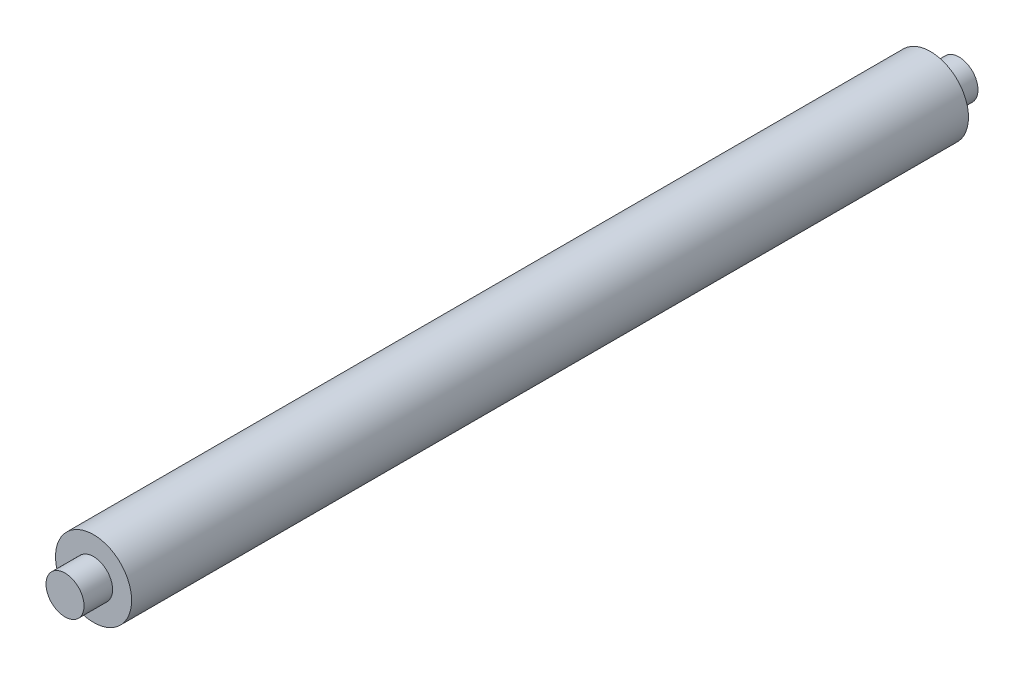
ISO-10303-21;
HEADER;
FILE_DESCRIPTION(('STEP AP214'),'2;1');
FILE_NAME('part.step','',(''),(''),'','','');
FILE_SCHEMA(('AUTOMOTIVE_DESIGN { 1 0 10303 214 1 1 1 1 }'));
ENDSEC;
DATA;
#1=APPLICATION_CONTEXT('core data for automotive mechanical design processes');
#2=APPLICATION_PROTOCOL_DEFINITION('international standard','automotive_design',2000,#1);
#3=PRODUCT_CONTEXT('',#1,'mechanical');
#4=PRODUCT('Part','Part','',(#3));
#5=PRODUCT_RELATED_PRODUCT_CATEGORY('part','',(#4));
#6=PRODUCT_DEFINITION_FORMATION('','',#4);
#7=PRODUCT_DEFINITION_CONTEXT('part definition',#1,'design');
#8=PRODUCT_DEFINITION('design','',#6,#7);
#9=PRODUCT_DEFINITION_SHAPE('','',#8);
#10=(LENGTH_UNIT() NAMED_UNIT(*) SI_UNIT(.MILLI.,.METRE.));
#11=(NAMED_UNIT(*) PLANE_ANGLE_UNIT() SI_UNIT($,.RADIAN.));
#12=(NAMED_UNIT(*) SI_UNIT($,.STERADIAN.) SOLID_ANGLE_UNIT());
#13=UNCERTAINTY_MEASURE_WITH_UNIT(LENGTH_MEASURE(1.E-05),#10,'distance_accuracy_value','');
#14=(GEOMETRIC_REPRESENTATION_CONTEXT(3) GLOBAL_UNCERTAINTY_ASSIGNED_CONTEXT((#13)) GLOBAL_UNIT_ASSIGNED_CONTEXT((#10,
#11,#12)) REPRESENTATION_CONTEXT('',''));
#15=CARTESIAN_POINT('',(0.,0.,0.));
#16=DIRECTION('',(0.,0.,1.));
#17=DIRECTION('',(1.,0.,0.));
#18=AXIS2_PLACEMENT_3D('',#15,#16,#17);
#19=CARTESIAN_POINT('',(0.,0.,279.4));
#20=DIRECTION('',(0.,0.,1.));
#21=DIRECTION('',(1.,0.,0.));
#22=AXIS2_PLACEMENT_3D('',#19,#20,#21);
#23=PLANE('',#22);
#24=CARTESIAN_POINT('',(0.,0.,279.4));
#25=DIRECTION('',(0.,0.,1.));
#26=DIRECTION('',(1.,0.,0.));
#27=AXIS2_PLACEMENT_3D('',#24,#25,#26);
#28=CIRCLE('',#27,25.4);
#29=CARTESIAN_POINT('',(25.4,0.,279.4));
#30=VERTEX_POINT('',#29);
#31=EDGE_CURVE('E10',#30,#30,#28,.T.);
#32=ORIENTED_EDGE('',*,*,#31,.T.);
#33=EDGE_LOOP('',(#32));
#34=FACE_BOUND('',#33,.T.);
#35=CARTESIAN_POINT('',(0.,0.,279.4));
#36=DIRECTION('',(0.,0.,1.));
#37=DIRECTION('',(1.,0.,0.));
#38=AXIS2_PLACEMENT_3D('',#35,#36,#37);
#39=CIRCLE('',#38,12.7);
#40=CARTESIAN_POINT('',(-12.7,0.,279.4));
#41=VERTEX_POINT('',#40);
#42=EDGE_CURVE('E45',#41,#41,#39,.T.);
#43=ORIENTED_EDGE('',*,*,#42,.F.);
#44=EDGE_LOOP('',(#43));
#45=FACE_BOUND('',#44,.T.);
#46=ADVANCED_FACE('F32',(#34,#45),#23,.T.);
#47=CARTESIAN_POINT('',(0.,0.,279.4));
#48=DIRECTION('',(0.,0.,-1.));
#49=DIRECTION('',(-1.,0.,0.));
#50=AXIS2_PLACEMENT_3D('',#47,#48,#49);
#51=CYLINDRICAL_SURFACE('',#50,25.4);
#52=ORIENTED_EDGE('',*,*,#31,.F.);
#53=EDGE_LOOP('',(#52));
#54=FACE_BOUND('',#53,.T.);
#55=CARTESIAN_POINT('',(0.,0.,-279.4));
#56=DIRECTION('',(0.,0.,1.));
#57=DIRECTION('',(1.,0.,0.));
#58=AXIS2_PLACEMENT_3D('',#55,#56,#57);
#59=CIRCLE('',#58,25.4);
#60=CARTESIAN_POINT('',(25.4,0.,-279.4));
#61=VERTEX_POINT('',#60);
#62=EDGE_CURVE('E36',#61,#61,#59,.T.);
#63=ORIENTED_EDGE('',*,*,#62,.T.);
#64=EDGE_LOOP('',(#63));
#65=FACE_BOUND('',#64,.T.);
#66=ADVANCED_FACE('F34',(#54,#65),#51,.T.);
#67=CARTESIAN_POINT('',(0.,0.,-279.4));
#68=DIRECTION('',(0.,0.,1.));
#69=DIRECTION('',(1.,0.,0.));
#70=AXIS2_PLACEMENT_3D('',#67,#68,#69);
#71=PLANE('',#70);
#72=CARTESIAN_POINT('',(0.,0.,-279.4));
#73=DIRECTION('',(0.,0.,1.));
#74=DIRECTION('',(1.,0.,0.));
#75=AXIS2_PLACEMENT_3D('',#72,#73,#74);
#76=CIRCLE('',#75,12.7);
#77=CARTESIAN_POINT('',(12.7,0.,-279.4));
#78=VERTEX_POINT('',#77);
#79=EDGE_CURVE('E51',#78,#78,#76,.T.);
#80=ORIENTED_EDGE('',*,*,#79,.T.);
#81=EDGE_LOOP('',(#80));
#82=FACE_BOUND('',#81,.T.);
#83=ORIENTED_EDGE('',*,*,#62,.F.);
#84=EDGE_LOOP('',(#83));
#85=FACE_BOUND('',#84,.T.);
#86=ADVANCED_FACE('F73',(#82,#85),#71,.F.);
#87=CARTESIAN_POINT('',(0.,0.,298.45));
#88=DIRECTION('',(0.,0.,-1.));
#89=DIRECTION('',(-1.,0.,0.));
#90=AXIS2_PLACEMENT_3D('',#87,#88,#89);
#91=CYLINDRICAL_SURFACE('',#90,12.7);
#92=CARTESIAN_POINT('',(0.,0.,298.45));
#93=DIRECTION('',(0.,0.,1.));
#94=DIRECTION('',(1.,0.,0.));
#95=AXIS2_PLACEMENT_3D('',#92,#93,#94);
#96=CIRCLE('',#95,12.7);
#97=CARTESIAN_POINT('',(-12.7,0.,298.45));
#98=VERTEX_POINT('',#97);
#99=EDGE_CURVE('E43',#98,#98,#96,.T.);
#100=CARTESIAN_POINT('',(-12.7,0.,298.45));
#101=CARTESIAN_POINT('',(-12.7,0.,298.2515625));
#102=CARTESIAN_POINT('',(-12.7,0.,298.053125));
#103=CARTESIAN_POINT('',(-12.7,0.,297.65625));
#104=CARTESIAN_POINT('',(-12.7,0.,297.4578125));
#105=CARTESIAN_POINT('',(-12.7,0.,297.0609375));
#106=CARTESIAN_POINT('',(-12.7,0.,296.8625));
#107=CARTESIAN_POINT('',(-12.7,0.,296.465625));
#108=CARTESIAN_POINT('',(-12.7,0.,296.2671875));
#109=CARTESIAN_POINT('',(-12.7,0.,295.8703125));
#110=CARTESIAN_POINT('',(-12.7,0.,295.671875));
#111=CARTESIAN_POINT('',(-12.7,0.,295.275));
#112=CARTESIAN_POINT('',(-12.7,0.,295.0765625));
#113=CARTESIAN_POINT('',(-12.7,0.,294.6796875));
#114=CARTESIAN_POINT('',(-12.7,0.,294.48125));
#115=CARTESIAN_POINT('',(-12.7,0.,294.084375));
#116=CARTESIAN_POINT('',(-12.7,0.,293.8859375));
#117=CARTESIAN_POINT('',(-12.7,0.,293.4890625));
#118=CARTESIAN_POINT('',(-12.7,0.,293.290625));
#119=CARTESIAN_POINT('',(-12.7,0.,292.89375));
#120=CARTESIAN_POINT('',(-12.7,0.,292.6953125));
#121=CARTESIAN_POINT('',(-12.7,0.,292.2984375));
#122=CARTESIAN_POINT('',(-12.7,0.,292.1));
#123=CARTESIAN_POINT('',(-12.7,0.,291.703125));
#124=CARTESIAN_POINT('',(-12.7,0.,291.5046875));
#125=CARTESIAN_POINT('',(-12.7,0.,291.1078125));
#126=CARTESIAN_POINT('',(-12.7,0.,290.909375));
#127=CARTESIAN_POINT('',(-12.7,0.,290.5125));
#128=CARTESIAN_POINT('',(-12.7,0.,290.3140625));
#129=CARTESIAN_POINT('',(-12.7,0.,289.9171875));
#130=CARTESIAN_POINT('',(-12.7,0.,289.71875));
#131=CARTESIAN_POINT('',(-12.7,0.,289.321875));
#132=CARTESIAN_POINT('',(-12.7,0.,289.1234375));
#133=CARTESIAN_POINT('',(-12.7,0.,288.7265625));
#134=CARTESIAN_POINT('',(-12.7,0.,288.528125));
#135=CARTESIAN_POINT('',(-12.7,0.,288.13125));
#136=CARTESIAN_POINT('',(-12.7,0.,287.9328125));
#137=CARTESIAN_POINT('',(-12.7,0.,287.5359375));
#138=CARTESIAN_POINT('',(-12.7,0.,287.3375));
#139=CARTESIAN_POINT('',(-12.7,0.,286.940625));
#140=CARTESIAN_POINT('',(-12.7,0.,286.7421875));
#141=CARTESIAN_POINT('',(-12.7,0.,286.3453125));
#142=CARTESIAN_POINT('',(-12.7,0.,286.146875));
#143=CARTESIAN_POINT('',(-12.7,0.,285.75));
#144=CARTESIAN_POINT('',(-12.7,0.,285.5515625));
#145=CARTESIAN_POINT('',(-12.7,0.,285.1546875));
#146=CARTESIAN_POINT('',(-12.7,0.,284.95625));
#147=CARTESIAN_POINT('',(-12.7,0.,284.559375));
#148=CARTESIAN_POINT('',(-12.7,0.,284.3609375));
#149=CARTESIAN_POINT('',(-12.7,0.,283.9640625));
#150=CARTESIAN_POINT('',(-12.7,0.,283.765625));
#151=CARTESIAN_POINT('',(-12.7,0.,283.36875));
#152=CARTESIAN_POINT('',(-12.7,0.,283.1703125));
#153=CARTESIAN_POINT('',(-12.7,0.,282.7734375));
#154=CARTESIAN_POINT('',(-12.7,0.,282.575));
#155=CARTESIAN_POINT('',(-12.7,0.,282.178125));
#156=CARTESIAN_POINT('',(-12.7,0.,281.9796875));
#157=CARTESIAN_POINT('',(-12.7,0.,281.5828125));
#158=CARTESIAN_POINT('',(-12.7,0.,281.384375));
#159=CARTESIAN_POINT('',(-12.7,0.,280.9875));
#160=CARTESIAN_POINT('',(-12.7,0.,280.7890625));
#161=CARTESIAN_POINT('',(-12.7,0.,280.3921875));
#162=CARTESIAN_POINT('',(-12.7,0.,280.19375));
#163=CARTESIAN_POINT('',(-12.7,0.,279.796875));
#164=CARTESIAN_POINT('',(-12.7,0.,279.5984375));
#165=CARTESIAN_POINT('',(-12.7,0.,279.4));
#166=B_SPLINE_CURVE_WITH_KNOTS('',3,(#100,#101,#102,#103,#104,#105,#106,#107,#108,#109,#110,
#111,#112,#113,#114,#115,#116,#117,#118,#119,#120,#121,#122,#123,#124,#125,#126,#127,#128,#129,
#130,#131,#132,#133,#134,#135,#136,#137,#138,#139,#140,#141,#142,#143,#144,#145,#146,#147,#148,
#149,#150,#151,#152,#153,#154,#155,#156,#157,#158,#159,#160,#161,#162,#163,#164,#165),
.UNSPECIFIED.,.F.,.F.,(4,2,2,2,2,2,2,2,2,2,2,2,2,2,2,2,2,2,2,2,2,2,2,2,2,2,2,2,2,2,2,2,4),(0.,
0.5953125,1.190625,1.7859375,2.38125,2.9765625,3.571875,4.1671875,4.7625,5.3578125,5.953125,
6.5484375,7.14375,7.7390625,8.334375,8.92968750000001,9.52500000000001,10.1203125,10.715625,
11.3109375,11.90625,12.5015625,13.096875,13.6921875,14.2875,14.8828125,15.478125,16.0734375,
16.66875,17.2640625,17.859375,18.4546875,19.05),.UNSPECIFIED.);
#167=EDGE_CURVE('BSEAM77',#98,#41,#166,.T.);
#168=ORIENTED_EDGE('',*,*,#99,.F.);
#169=ORIENTED_EDGE('',*,*,#42,.T.);
#170=ORIENTED_EDGE('',*,*,#167,.T.);
#171=ORIENTED_EDGE('',*,*,#167,.F.);
#172=EDGE_LOOP('',(#168,#170,#169,#171));
#173=FACE_BOUND('',#172,.T.);
#174=ADVANCED_FACE('F77',(#173),#91,.T.);
#175=CARTESIAN_POINT('',(0.,0.,298.45));
#176=DIRECTION('',(0.,0.,1.));
#177=DIRECTION('',(1.,0.,0.));
#178=AXIS2_PLACEMENT_3D('',#175,#176,#177);
#179=PLANE('',#178);
#180=ORIENTED_EDGE('',*,*,#99,.T.);
#181=EDGE_LOOP('',(#180));
#182=FACE_BOUND('',#181,.T.);
#183=ADVANCED_FACE('F66',(#182),#179,.T.);
#184=CARTESIAN_POINT('',(0.,0.,-298.45));
#185=DIRECTION('',(0.,0.,1.));
#186=DIRECTION('',(1.,0.,0.));
#187=AXIS2_PLACEMENT_3D('',#184,#185,#186);
#188=CYLINDRICAL_SURFACE('',#187,12.7);
#189=CARTESIAN_POINT('',(0.,0.,-298.45));
#190=DIRECTION('',(0.,0.,1.));
#191=DIRECTION('',(1.,0.,0.));
#192=AXIS2_PLACEMENT_3D('',#189,#190,#191);
#193=CIRCLE('',#192,12.7);
#194=CARTESIAN_POINT('',(12.7,0.,-298.45));
#195=VERTEX_POINT('',#194);
#196=EDGE_CURVE('E48',#195,#195,#193,.T.);
#197=CARTESIAN_POINT('',(12.7,0.,-298.45));
#198=CARTESIAN_POINT('',(12.7,0.,-298.2515625));
#199=CARTESIAN_POINT('',(12.7,0.,-298.053125));
#200=CARTESIAN_POINT('',(12.7,0.,-297.65625));
#201=CARTESIAN_POINT('',(12.7,0.,-297.4578125));
#202=CARTESIAN_POINT('',(12.7,0.,-297.0609375));
#203=CARTESIAN_POINT('',(12.7,0.,-296.8625));
#204=CARTESIAN_POINT('',(12.7,0.,-296.465625));
#205=CARTESIAN_POINT('',(12.7,0.,-296.2671875));
#206=CARTESIAN_POINT('',(12.7,0.,-295.8703125));
#207=CARTESIAN_POINT('',(12.7,0.,-295.671875));
#208=CARTESIAN_POINT('',(12.7,0.,-295.275));
#209=CARTESIAN_POINT('',(12.7,0.,-295.0765625));
#210=CARTESIAN_POINT('',(12.7,0.,-294.6796875));
#211=CARTESIAN_POINT('',(12.7,0.,-294.48125));
#212=CARTESIAN_POINT('',(12.7,0.,-294.084375));
#213=CARTESIAN_POINT('',(12.7,0.,-293.8859375));
#214=CARTESIAN_POINT('',(12.7,0.,-293.4890625));
#215=CARTESIAN_POINT('',(12.7,0.,-293.290625));
#216=CARTESIAN_POINT('',(12.7,0.,-292.89375));
#217=CARTESIAN_POINT('',(12.7,0.,-292.6953125));
#218=CARTESIAN_POINT('',(12.7,0.,-292.2984375));
#219=CARTESIAN_POINT('',(12.7,0.,-292.1));
#220=CARTESIAN_POINT('',(12.7,0.,-291.703125));
#221=CARTESIAN_POINT('',(12.7,0.,-291.5046875));
#222=CARTESIAN_POINT('',(12.7,0.,-291.1078125));
#223=CARTESIAN_POINT('',(12.7,0.,-290.909375));
#224=CARTESIAN_POINT('',(12.7,0.,-290.5125));
#225=CARTESIAN_POINT('',(12.7,0.,-290.3140625));
#226=CARTESIAN_POINT('',(12.7,0.,-289.9171875));
#227=CARTESIAN_POINT('',(12.7,0.,-289.71875));
#228=CARTESIAN_POINT('',(12.7,0.,-289.321875));
#229=CARTESIAN_POINT('',(12.7,0.,-289.1234375));
#230=CARTESIAN_POINT('',(12.7,0.,-288.7265625));
#231=CARTESIAN_POINT('',(12.7,0.,-288.528125));
#232=CARTESIAN_POINT('',(12.7,0.,-288.13125));
#233=CARTESIAN_POINT('',(12.7,0.,-287.9328125));
#234=CARTESIAN_POINT('',(12.7,0.,-287.5359375));
#235=CARTESIAN_POINT('',(12.7,0.,-287.3375));
#236=CARTESIAN_POINT('',(12.7,0.,-286.940625));
#237=CARTESIAN_POINT('',(12.7,0.,-286.7421875));
#238=CARTESIAN_POINT('',(12.7,0.,-286.3453125));
#239=CARTESIAN_POINT('',(12.7,0.,-286.146875));
#240=CARTESIAN_POINT('',(12.7,0.,-285.75));
#241=CARTESIAN_POINT('',(12.7,0.,-285.5515625));
#242=CARTESIAN_POINT('',(12.7,0.,-285.1546875));
#243=CARTESIAN_POINT('',(12.7,0.,-284.95625));
#244=CARTESIAN_POINT('',(12.7,0.,-284.559375));
#245=CARTESIAN_POINT('',(12.7,0.,-284.3609375));
#246=CARTESIAN_POINT('',(12.7,0.,-283.9640625));
#247=CARTESIAN_POINT('',(12.7,0.,-283.765625));
#248=CARTESIAN_POINT('',(12.7,0.,-283.36875));
#249=CARTESIAN_POINT('',(12.7,0.,-283.1703125));
#250=CARTESIAN_POINT('',(12.7,0.,-282.7734375));
#251=CARTESIAN_POINT('',(12.7,0.,-282.575));
#252=CARTESIAN_POINT('',(12.7,0.,-282.178125));
#253=CARTESIAN_POINT('',(12.7,0.,-281.9796875));
#254=CARTESIAN_POINT('',(12.7,0.,-281.5828125));
#255=CARTESIAN_POINT('',(12.7,0.,-281.384375));
#256=CARTESIAN_POINT('',(12.7,0.,-280.9875));
#257=CARTESIAN_POINT('',(12.7,0.,-280.7890625));
#258=CARTESIAN_POINT('',(12.7,0.,-280.3921875));
#259=CARTESIAN_POINT('',(12.7,0.,-280.19375));
#260=CARTESIAN_POINT('',(12.7,0.,-279.796875));
#261=CARTESIAN_POINT('',(12.7,0.,-279.5984375));
#262=CARTESIAN_POINT('',(12.7,0.,-279.4));
#263=B_SPLINE_CURVE_WITH_KNOTS('',3,(#197,#198,#199,#200,#201,#202,#203,#204,#205,#206,#207,
#208,#209,#210,#211,#212,#213,#214,#215,#216,#217,#218,#219,#220,#221,#222,#223,#224,#225,#226,
#227,#228,#229,#230,#231,#232,#233,#234,#235,#236,#237,#238,#239,#240,#241,#242,#243,#244,#245,
#246,#247,#248,#249,#250,#251,#252,#253,#254,#255,#256,#257,#258,#259,#260,#261,#262),
.UNSPECIFIED.,.F.,.F.,(4,2,2,2,2,2,2,2,2,2,2,2,2,2,2,2,2,2,2,2,2,2,2,2,2,2,2,2,2,2,2,2,4),(0.,
0.595312499999945,1.19062499999995,1.78593749999995,2.38124999999995,2.97656249999995,
3.57187499999995,4.16718749999995,4.76249999999995,5.35781249999995,5.95312499999995,
6.54843749999995,7.14374999999995,7.73906249999995,8.33437499999995,8.92968749999995,
9.52499999999995,10.1203125,10.715625,11.3109375,11.90625,12.5015625,13.096875,13.6921875,
14.2875,14.8828125,15.478125,16.0734375,16.66875,17.2640625,17.859375,18.4546875,19.05),.UNSPECIFIED.);
#264=EDGE_CURVE('BSEAM57',#195,#78,#263,.T.);
#265=ORIENTED_EDGE('',*,*,#196,.T.);
#266=ORIENTED_EDGE('',*,*,#79,.F.);
#267=ORIENTED_EDGE('',*,*,#264,.T.);
#268=ORIENTED_EDGE('',*,*,#264,.F.);
#269=EDGE_LOOP('',(#265,#267,#266,#268));
#270=FACE_BOUND('',#269,.T.);
#271=ADVANCED_FACE('F57',(#270),#188,.T.);
#272=CARTESIAN_POINT('',(0.,0.,-298.45));
#273=DIRECTION('',(0.,0.,-1.));
#274=DIRECTION('',(1.,0.,0.));
#275=AXIS2_PLACEMENT_3D('',#272,#273,#274);
#276=PLANE('',#275);
#277=ORIENTED_EDGE('',*,*,#196,.F.);
#278=EDGE_LOOP('',(#277));
#279=FACE_BOUND('',#278,.T.);
#280=ADVANCED_FACE('F60',(#279),#276,.T.);
#281=CLOSED_SHELL('',(#46,#66,#86,#174,#183,#271,#280));
#282=MANIFOLD_SOLID_BREP('B2',#281);
#283=ADVANCED_BREP_SHAPE_REPRESENTATION('',(#18,#282),#14);
#284=SHAPE_DEFINITION_REPRESENTATION(#9,#283);
ENDSEC;
END-ISO-10303-21;
